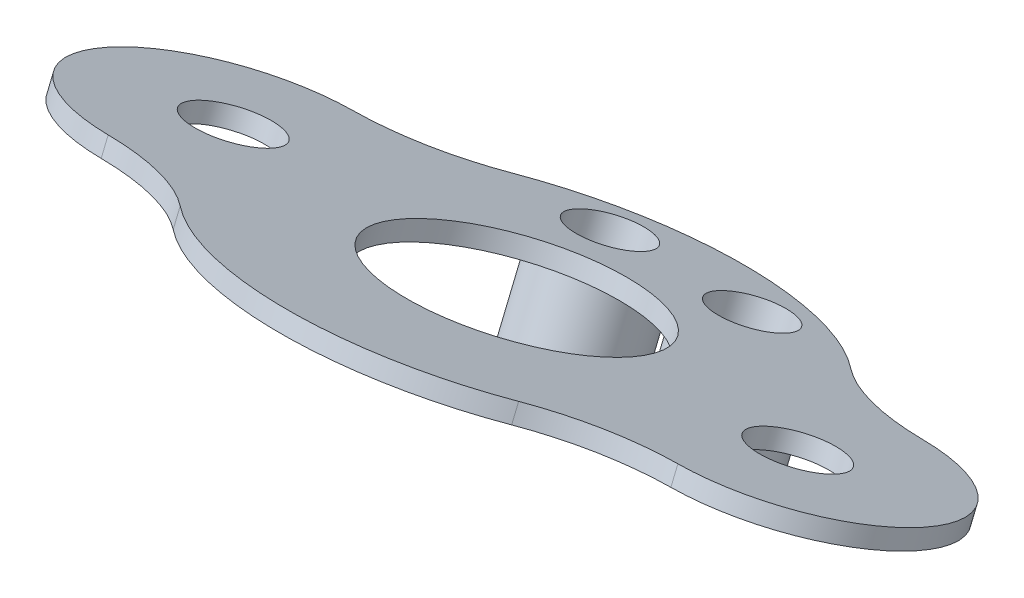
ISO-10303-21;
HEADER;
FILE_DESCRIPTION(('STEP AP214'),'2;1');
FILE_NAME('part.step','',(''),(''),'','','');
FILE_SCHEMA(('AUTOMOTIVE_DESIGN { 1 0 10303 214 1 1 1 1 }'));
ENDSEC;
DATA;
#1=APPLICATION_CONTEXT('core data for automotive mechanical design processes');
#2=APPLICATION_PROTOCOL_DEFINITION('international standard','automotive_design',2000,#1);
#3=PRODUCT_CONTEXT('',#1,'mechanical');
#4=PRODUCT('Part','Part','',(#3));
#5=PRODUCT_RELATED_PRODUCT_CATEGORY('part','',(#4));
#6=PRODUCT_DEFINITION_FORMATION('','',#4);
#7=PRODUCT_DEFINITION_CONTEXT('part definition',#1,'design');
#8=PRODUCT_DEFINITION('design','',#6,#7);
#9=PRODUCT_DEFINITION_SHAPE('','',#8);
#10=(LENGTH_UNIT() NAMED_UNIT(*) SI_UNIT(.MILLI.,.METRE.));
#11=(NAMED_UNIT(*) PLANE_ANGLE_UNIT() SI_UNIT($,.RADIAN.));
#12=(NAMED_UNIT(*) SI_UNIT($,.STERADIAN.) SOLID_ANGLE_UNIT());
#13=UNCERTAINTY_MEASURE_WITH_UNIT(LENGTH_MEASURE(1.E-05),#10,'distance_accuracy_value','');
#14=(GEOMETRIC_REPRESENTATION_CONTEXT(3) GLOBAL_UNCERTAINTY_ASSIGNED_CONTEXT((#13)) GLOBAL_UNIT_ASSIGNED_CONTEXT((#10,
#11,#12)) REPRESENTATION_CONTEXT('',''));
#15=CARTESIAN_POINT('',(0.,0.,0.));
#16=DIRECTION('',(0.,0.,1.));
#17=DIRECTION('',(1.,0.,0.));
#18=AXIS2_PLACEMENT_3D('',#15,#16,#17);
#19=CARTESIAN_POINT('',(0.,-29.9756447491099,12.4163185959592));
#20=DIRECTION('',(0.,-0.923879532511286,0.382683432365091));
#21=DIRECTION('',(0.,-0.382683432365091,-0.923879532511286));
#22=AXIS2_PLACEMENT_3D('',#19,#20,#21);
#23=PLANE('',#22);
#24=CARTESIAN_POINT('',(15.3672432244122,-30.7811706415145,10.4716070616733));
#25=DIRECTION('',(0.,-0.923879532511286,0.382683432365091));
#26=DIRECTION('',(0.,-0.382683432365091,-0.923879532511286));
#27=AXIS2_PLACEMENT_3D('',#24,#25,#26);
#28=CIRCLE('',#27,2.24999999999842);
#29=CARTESIAN_POINT('',(15.3672432244122,-31.6422083643353,8.39287811352438));
#30=VERTEX_POINT('',#29);
#31=EDGE_CURVE('E247',#30,#30,#28,.T.);
#32=ORIENTED_EDGE('',*,*,#31,.T.);
#33=EDGE_LOOP('',(#32));
#34=FACE_BOUND('',#33,.T.);
#35=CARTESIAN_POINT('',(-3.92196684187772,-34.5186678296089,1.44849066084454));
#36=DIRECTION('',(0.,-0.923879532511286,0.382683432365091));
#37=DIRECTION('',(0.,-0.382683432365091,-0.923879532511286));
#38=AXIS2_PLACEMENT_3D('',#35,#36,#37);
#39=CIRCLE('',#38,2.);
#40=CARTESIAN_POINT('',(-3.92196684187772,-35.284034694339,-0.399268404178036));
#41=VERTEX_POINT('',#40);
#42=EDGE_CURVE('E53',#41,#41,#39,.T.);
#43=ORIENTED_EDGE('',*,*,#42,.T.);
#44=EDGE_LOOP('',(#43));
#45=FACE_BOUND('',#44,.T.);
#46=CARTESIAN_POINT('',(3.82318641332406,-34.5309823384265,1.41876080664299));
#47=DIRECTION('',(0.,-0.923879532511286,0.382683432365091));
#48=DIRECTION('',(0.,-0.382683432365091,-0.923879532511286));
#49=AXIS2_PLACEMENT_3D('',#46,#47,#48);
#50=CIRCLE('',#49,2.);
#51=CARTESIAN_POINT('',(3.82318641332406,-35.2963492031567,-0.428998258379579));
#52=VERTEX_POINT('',#51);
#53=EDGE_CURVE('E250',#52,#52,#50,.T.);
#54=ORIENTED_EDGE('',*,*,#53,.T.);
#55=EDGE_LOOP('',(#54));
#56=FACE_BOUND('',#55,.T.);
#57=CARTESIAN_POINT('',(-15.5,-30.7811715076341,10.4716049706756));
#58=DIRECTION('',(0.,-0.923879532511286,0.382683432365091));
#59=DIRECTION('',(0.,-0.382683432365091,-0.923879532511286));
#60=AXIS2_PLACEMENT_3D('',#57,#58,#59);
#61=CIRCLE('',#60,2.25);
#62=CARTESIAN_POINT('',(-15.5,-31.6422092304555,8.39287602252525));
#63=VERTEX_POINT('',#62);
#64=EDGE_CURVE('E243',#63,#63,#61,.T.);
#65=ORIENTED_EDGE('',*,*,#64,.T.);
#66=EDGE_LOOP('',(#65));
#67=FACE_BOUND('',#66,.T.);
#68=CARTESIAN_POINT('',(0.,-30.7811715076341,10.4716049706756));
#69=DIRECTION('',(0.,-0.923879532511286,0.382683432365091));
#70=DIRECTION('',(0.,-0.382683432365091,-0.923879532511286));
#71=AXIS2_PLACEMENT_3D('',#68,#69,#70);
#72=CIRCLE('',#71,6.5);
#73=CARTESIAN_POINT('',(0.,-33.2686138180071,4.46638800935228));
#74=VERTEX_POINT('',#73);
#75=EDGE_CURVE('E139',#74,#74,#72,.T.);
#76=ORIENTED_EDGE('',*,*,#75,.T.);
#77=EDGE_LOOP('',(#76));
#78=FACE_BOUND('',#77,.T.);
#79=CARTESIAN_POINT('',(-15.496913231097,-30.7811706415145,10.4716070616731));
#80=DIRECTION('',(0.,-0.923879532511286,0.382683432365091));
#81=DIRECTION('',(0.,-0.382683432365091,-0.923879532511286));
#82=AXIS2_PLACEMENT_3D('',#79,#80,#81);
#83=CIRCLE('',#82,7.25000000000001);
#84=CARTESIAN_POINT('',(-15.6411975797355,-28.0072652384155,17.1684071065748));
#85=VERTEX_POINT('',#84);
#86=CARTESIAN_POINT('',(-15.6411975797355,-33.5550760446136,3.77480701677136));
#87=VERTEX_POINT('',#86);
#88=EDGE_CURVE('E131',#85,#87,#83,.T.);
#89=ORIENTED_EDGE('',*,*,#88,.F.);
#90=CARTESIAN_POINT('',(-15.8302598296755,-24.3724926412512,25.9435244067909));
#91=DIRECTION('',(0.,-0.923879532511286,0.382683432365091));
#92=DIRECTION('',(0.,-0.382683432365091,-0.923879532511286));
#93=AXIS2_PLACEMENT_3D('',#90,#91,#92);
#94=CIRCLE('',#93,9.5);
#95=CARTESIAN_POINT('',(-9.3184539231463,-27.0195552935339,19.5529498511988));
#96=VERTEX_POINT('',#95);
#97=EDGE_CURVE('E148',#96,#85,#94,.F.);
#98=ORIENTED_EDGE('',*,*,#97,.F.);
#99=CARTESIAN_POINT('',(-0.0648350033416456,-30.7811706415145,10.4716070616731));
#100=DIRECTION('',(0.,-0.923879532511286,0.382683432365091));
#101=DIRECTION('',(0.,-0.382683432365091,-0.923879532511286));
#102=AXIS2_PLACEMENT_3D('',#99,#100,#101);
#103=CIRCLE('',#102,13.5);
#104=CARTESIAN_POINT('',(9.18878391646293,-27.0195552935339,19.5529498511989));
#105=VERTEX_POINT('',#104);
#106=EDGE_CURVE('E226',#105,#96,#103,.T.);
#107=ORIENTED_EDGE('',*,*,#106,.F.);
#108=CARTESIAN_POINT('',(15.7005898229921,-24.3724926412511,25.9435244067911));
#109=DIRECTION('',(0.,-0.923879532511286,0.382683432365091));
#110=DIRECTION('',(0.,-0.382683432365091,-0.923879532511286));
#111=AXIS2_PLACEMENT_3D('',#108,#109,#110);
#112=CIRCLE('',#111,9.5);
#113=CARTESIAN_POINT('',(15.5115275730522,-28.0072652384154,17.168407106575));
#114=VERTEX_POINT('',#113);
#115=EDGE_CURVE('E229',#114,#105,#112,.F.);
#116=ORIENTED_EDGE('',*,*,#115,.F.);
#117=CARTESIAN_POINT('',(15.3672432244122,-30.7811706415145,10.4716070616733));
#118=DIRECTION('',(0.,-0.923879532511286,0.382683432365091));
#119=DIRECTION('',(0.,-0.382683432365091,-0.923879532511286));
#120=AXIS2_PLACEMENT_3D('',#117,#118,#119);
#121=CIRCLE('',#120,7.25000000000004);
#122=CARTESIAN_POINT('',(15.5115275730525,-33.5550760446135,3.77480701677158));
#123=VERTEX_POINT('',#122);
#124=EDGE_CURVE('E232',#123,#114,#121,.T.);
#125=ORIENTED_EDGE('',*,*,#124,.F.);
#126=CARTESIAN_POINT('',(15.7005898229925,-37.1898486417778,-5.0003102834445));
#127=DIRECTION('',(0.,-0.923879532511286,0.382683432365091));
#128=DIRECTION('',(0.,-0.382683432365091,-0.923879532511286));
#129=AXIS2_PLACEMENT_3D('',#126,#127,#128);
#130=CIRCLE('',#129,9.5);
#131=CARTESIAN_POINT('',(9.18878391646324,-34.5427859894952,1.39026427214755));
#132=VERTEX_POINT('',#131);
#133=EDGE_CURVE('E235',#132,#123,#130,.F.);
#134=ORIENTED_EDGE('',*,*,#133,.F.);
#135=CARTESIAN_POINT('',(-0.0648350033416456,-30.7811706415145,10.4716070616731));
#136=DIRECTION('',(0.,-0.923879532511286,0.382683432365091));
#137=DIRECTION('',(0.,-0.382683432365091,-0.923879532511286));
#138=AXIS2_PLACEMENT_3D('',#135,#136,#137);
#139=CIRCLE('',#138,13.5);
#140=CARTESIAN_POINT('',(-9.31845392314631,-34.5427859894952,1.39026427214741));
#141=VERTEX_POINT('',#140);
#142=EDGE_CURVE('E134',#141,#132,#139,.T.);
#143=ORIENTED_EDGE('',*,*,#142,.F.);
#144=CARTESIAN_POINT('',(-15.8302598296755,-37.1898486417779,-5.0003102834447));
#145=DIRECTION('',(0.,-0.923879532511286,0.382683432365091));
#146=DIRECTION('',(0.,-0.382683432365091,-0.923879532511286));
#147=AXIS2_PLACEMENT_3D('',#144,#145,#146);
#148=CIRCLE('',#147,9.5);
#149=EDGE_CURVE('E128',#87,#141,#148,.F.);
#150=ORIENTED_EDGE('',*,*,#149,.F.);
#151=EDGE_LOOP('',(#89,#98,#107,#116,#125,#134,#143,#150));
#152=FACE_BOUND('',#151,.T.);
#153=ADVANCED_FACE('F50',(#34,#45,#56,#67,#78,#152),#23,.F.);
#154=CARTESIAN_POINT('',(-3.92196684187772,-40.0619450246766,3.74459125503508));
#155=DIRECTION('',(0.,0.923879532511287,-0.382683432365091));
#156=DIRECTION('',(0.,0.382683432365091,0.923879532511287));
#157=AXIS2_PLACEMENT_3D('',#154,#155,#156);
#158=CYLINDRICAL_SURFACE('',#157,2.99938188325268);
#159=CARTESIAN_POINT('',(-3.92196684187772,-40.0619450246766,3.74459125503508));
#160=DIRECTION('',(0.,-0.923879532511286,0.382683432365091));
#161=DIRECTION('',(0.,-0.382683432365091,-0.923879532511286));
#162=AXIS2_PLACEMENT_3D('',#159,#160,#161);
#163=CIRCLE('',#162,2.99938188325268);
#164=CARTESIAN_POINT('',(-3.92196684187772,-41.2097587787334,0.973523722912777));
#165=VERTEX_POINT('',#164);
#166=EDGE_CURVE('E206',#165,#165,#163,.T.);
#167=ORIENTED_EDGE('',*,*,#166,.F.);
#168=EDGE_LOOP('',(#167));
#169=FACE_BOUND('',#168,.T.);
#170=CARTESIAN_POINT('',(-3.92196684187772,-35.4425473621201,1.83117409320963));
#171=DIRECTION('',(0.,-0.923879532511286,0.382683432365091));
#172=DIRECTION('',(0.,-0.382683432365091,-0.923879532511286));
#173=AXIS2_PLACEMENT_3D('',#170,#171,#172);
#174=CIRCLE('',#173,2.99938188325268);
#175=CARTESIAN_POINT('',(-5.02371258952765,-36.5101208354187,-0.746176264857528));
#176=VERTEX_POINT('',#175);
#177=EDGE_CURVE('E207',#176,#176,#174,.T.);
#178=ORIENTED_EDGE('',*,*,#177,.T.);
#179=EDGE_LOOP('',(#178));
#180=FACE_BOUND('',#179,.T.);
#181=ADVANCED_FACE('F277',(#169,#180),#158,.T.);
#182=CARTESIAN_POINT('',(3.82318641332406,-40.0742595334942,3.71486140083353));
#183=DIRECTION('',(0.,0.923879532511287,-0.382683432365091));
#184=DIRECTION('',(0.,0.382683432365091,0.923879532511287));
#185=AXIS2_PLACEMENT_3D('',#182,#183,#184);
#186=CYLINDRICAL_SURFACE('',#185,2.99938188325268);
#187=CARTESIAN_POINT('',(3.82318641332406,-40.0742595334942,3.71486140083353));
#188=DIRECTION('',(0.,-0.923879532511286,0.382683432365091));
#189=DIRECTION('',(0.,0.382683432365091,0.923879532511286));
#190=AXIS2_PLACEMENT_3D('',#187,#188,#189);
#191=CIRCLE('',#190,2.99938188325268);
#192=CARTESIAN_POINT('',(3.82318641332406,-38.9264457794374,6.48592893295584));
#193=VERTEX_POINT('',#192);
#194=EDGE_CURVE('E218',#193,#193,#191,.T.);
#195=ORIENTED_EDGE('',*,*,#194,.F.);
#196=EDGE_LOOP('',(#195));
#197=FACE_BOUND('',#196,.T.);
#198=CARTESIAN_POINT('',(3.82318641332406,-35.4548618709378,1.80144423900808));
#199=DIRECTION('',(0.,-0.923879532511286,0.382683432365091));
#200=DIRECTION('',(0.,0.382683432365091,0.923879532511286));
#201=AXIS2_PLACEMENT_3D('',#198,#199,#200);
#202=CIRCLE('',#201,2.99938188325268);
#203=CARTESIAN_POINT('',(4.38829935799805,-36.582118852568,-0.919994854323285));
#204=VERTEX_POINT('',#203);
#205=CARTESIAN_POINT('',(5.43144928763638,-36.4237224757199,-0.537592173105759));
#206=VERTEX_POINT('',#205);
#207=EDGE_CURVE('E59',#204,#206,#202,.T.);
#208=ORIENTED_EDGE('',*,*,#207,.T.);
#209=CARTESIAN_POINT('',(3.82318641332406,-35.4548618709378,1.80144423900808));
#210=DIRECTION('',(0.,-0.923879532511286,0.382683432365091));
#211=DIRECTION('',(0.,-0.382683432365091,-0.923879532511286));
#212=AXIS2_PLACEMENT_3D('',#209,#210,#211);
#213=CIRCLE('',#212,2.99938188325268);
#214=EDGE_CURVE('E66',#204,#206,#213,.F.);
#215=ORIENTED_EDGE('',*,*,#214,.F.);
#216=EDGE_LOOP('',(#208,#215));
#217=FACE_BOUND('',#216,.T.);
#218=ADVANCED_FACE('F282',(#197,#217),#186,.T.);
#219=CARTESIAN_POINT('',(3.82318641332406,-35.4548618709378,1.80144423900808));
#220=DIRECTION('',(0.,0.923879532511286,-0.382683432365091));
#221=DIRECTION('',(0.,0.382683432365091,0.923879532511286));
#222=AXIS2_PLACEMENT_3D('',#219,#220,#221);
#223=PLANE('',#222);
#224=CARTESIAN_POINT('',(-0.0648350033416456,-31.7050501740258,10.8542904940382));
#225=DIRECTION('',(0.,-0.923879532511286,0.382683432365091));
#226=DIRECTION('',(0.,-0.382683432365091,-0.923879532511286));
#227=AXIS2_PLACEMENT_3D('',#224,#225,#226);
#228=CIRCLE('',#227,13.5);
#229=EDGE_CURVE('E468',#204,#206,#228,.T.);
#230=ORIENTED_EDGE('',*,*,#229,.T.);
#231=ORIENTED_EDGE('',*,*,#207,.F.);
#232=EDGE_LOOP('',(#230,#231));
#233=FACE_BOUND('',#232,.T.);
#234=ADVANCED_FACE('F320',(#233),#223,.T.);
#235=CARTESIAN_POINT('',(-0.0648350033416456,-30.7811706415146,10.4716070616731));
#236=DIRECTION('',(0.,0.923879532511286,-0.382683432365091));
#237=DIRECTION('',(0.,0.382683432365091,0.923879532511286));
#238=AXIS2_PLACEMENT_3D('',#235,#236,#237);
#239=CYLINDRICAL_SURFACE('',#238,13.5);
#240=DIRECTION('',(0.,0.923879532511286,-0.382683432365091));
#241=VECTOR('',#240,1.);
#242=CARTESIAN_POINT('',(-9.31845392314631,-34.5427859894952,1.39026427214741));
#243=LINE('',#242,#241);
#244=CARTESIAN_POINT('',(-9.3184539231463,-35.4666655220065,1.77294770451251));
#245=VERTEX_POINT('',#244);
#246=EDGE_CURVE('E165',#245,#141,#243,.T.);
#247=ORIENTED_EDGE('',*,*,#246,.T.);
#248=ORIENTED_EDGE('',*,*,#142,.T.);
#249=DIRECTION('',(0.,0.923879532511286,-0.382683432365091));
#250=VECTOR('',#249,1.);
#251=CARTESIAN_POINT('',(9.18878391646324,-34.5427859894952,1.39026427214755));
#252=LINE('',#251,#250);
#253=CARTESIAN_POINT('',(9.18878391646323,-35.4666655220064,1.77294770451266));
#254=VERTEX_POINT('',#253);
#255=EDGE_CURVE('E163',#254,#132,#252,.T.);
#256=ORIENTED_EDGE('',*,*,#255,.F.);
#257=EDGE_CURVE('E193',#206,#254,#228,.T.);
#258=ORIENTED_EDGE('',*,*,#257,.F.);
#259=ORIENTED_EDGE('',*,*,#229,.F.);
#260=EDGE_CURVE('E192',#176,#204,#228,.T.);
#261=ORIENTED_EDGE('',*,*,#260,.F.);
#262=EDGE_CURVE('E74',#245,#176,#228,.T.);
#263=ORIENTED_EDGE('',*,*,#262,.F.);
#264=EDGE_LOOP('',(#247,#248,#256,#258,#259,#261,#263));
#265=FACE_BOUND('',#264,.T.);
#266=ADVANCED_FACE('F316',(#265),#239,.T.);
#267=CARTESIAN_POINT('',(15.7005898229925,-37.1898486417778,-5.0003102834445));
#268=DIRECTION('',(0.,0.923879532511286,-0.382683432365091));
#269=DIRECTION('',(0.,0.382683432365091,0.923879532511286));
#270=AXIS2_PLACEMENT_3D('',#267,#268,#269);
#271=CYLINDRICAL_SURFACE('',#270,9.5);
#272=ORIENTED_EDGE('',*,*,#255,.T.);
#273=ORIENTED_EDGE('',*,*,#133,.T.);
#274=DIRECTION('',(0.,0.923879532511286,-0.382683432365091));
#275=VECTOR('',#274,1.);
#276=CARTESIAN_POINT('',(15.5115275730525,-33.5550760446135,3.77480701677158));
#277=LINE('',#276,#275);
#278=CARTESIAN_POINT('',(15.5115275730524,-34.4789555771248,4.15749044913667));
#279=VERTEX_POINT('',#278);
#280=EDGE_CURVE('E480',#279,#123,#277,.T.);
#281=ORIENTED_EDGE('',*,*,#280,.F.);
#282=CARTESIAN_POINT('',(15.7005898229925,-38.1137281742891,-4.61762685107941));
#283=DIRECTION('',(0.,0.923879532511286,-0.382683432365091));
#284=DIRECTION('',(0.,-0.382683432365091,-0.923879532511286));
#285=AXIS2_PLACEMENT_3D('',#282,#283,#284);
#286=CIRCLE('',#285,9.50000000000002);
#287=EDGE_CURVE('E186',#254,#279,#286,.T.);
#288=ORIENTED_EDGE('',*,*,#287,.F.);
#289=EDGE_LOOP('',(#272,#273,#281,#288));
#290=FACE_BOUND('',#289,.T.);
#291=ADVANCED_FACE('F319',(#290),#271,.F.);
#292=CARTESIAN_POINT('',(15.3672432244122,-30.7811706415145,10.4716070616733));
#293=DIRECTION('',(0.,0.923879532511286,-0.382683432365091));
#294=DIRECTION('',(0.,0.382683432365091,0.923879532511286));
#295=AXIS2_PLACEMENT_3D('',#292,#293,#294);
#296=CYLINDRICAL_SURFACE('',#295,7.25000000000004);
#297=ORIENTED_EDGE('',*,*,#280,.T.);
#298=ORIENTED_EDGE('',*,*,#124,.T.);
#299=DIRECTION('',(0.,0.923879532511286,-0.382683432365091));
#300=VECTOR('',#299,1.);
#301=CARTESIAN_POINT('',(15.5115275730522,-28.0072652384154,17.168407106575));
#302=LINE('',#301,#300);
#303=CARTESIAN_POINT('',(15.5115275730523,-28.9311447709267,17.5510905389401));
#304=VERTEX_POINT('',#303);
#305=EDGE_CURVE('E485',#304,#114,#302,.T.);
#306=ORIENTED_EDGE('',*,*,#305,.F.);
#307=CARTESIAN_POINT('',(15.3672432244122,-31.7050501740257,10.8542904940384));
#308=DIRECTION('',(0.,-0.923879532511286,0.382683432365091));
#309=DIRECTION('',(0.,-0.382683432365091,-0.923879532511286));
#310=AXIS2_PLACEMENT_3D('',#307,#308,#309);
#311=CIRCLE('',#310,7.25000000000004);
#312=EDGE_CURVE('E182',#279,#304,#311,.T.);
#313=ORIENTED_EDGE('',*,*,#312,.F.);
#314=EDGE_LOOP('',(#297,#298,#306,#313));
#315=FACE_BOUND('',#314,.T.);
#316=ADVANCED_FACE('F324',(#315),#296,.T.);
#317=CARTESIAN_POINT('',(15.7005898229921,-24.3724926412511,25.9435244067911));
#318=DIRECTION('',(0.,0.923879532511286,-0.382683432365091));
#319=DIRECTION('',(0.,0.382683432365091,0.923879532511286));
#320=AXIS2_PLACEMENT_3D('',#317,#318,#319);
#321=CYLINDRICAL_SURFACE('',#320,9.5);
#322=ORIENTED_EDGE('',*,*,#305,.T.);
#323=ORIENTED_EDGE('',*,*,#115,.T.);
#324=DIRECTION('',(0.,0.923879532511286,-0.382683432365091));
#325=VECTOR('',#324,1.);
#326=CARTESIAN_POINT('',(9.18878391646293,-27.0195552935339,19.5529498511989));
#327=LINE('',#326,#325);
#328=CARTESIAN_POINT('',(9.18878391646294,-27.9434348260451,19.935633283564));
#329=VERTEX_POINT('',#328);
#330=EDGE_CURVE('E489',#329,#105,#327,.T.);
#331=ORIENTED_EDGE('',*,*,#330,.F.);
#332=CARTESIAN_POINT('',(15.7005898229921,-25.2963721737624,26.3262078391562));
#333=DIRECTION('',(0.,0.923879532511286,-0.382683432365091));
#334=DIRECTION('',(0.,-0.382683432365091,-0.923879532511286));
#335=AXIS2_PLACEMENT_3D('',#332,#333,#334);
#336=CIRCLE('',#335,9.50000000000001);
#337=EDGE_CURVE('E178',#304,#329,#336,.T.);
#338=ORIENTED_EDGE('',*,*,#337,.F.);
#339=EDGE_LOOP('',(#322,#323,#331,#338));
#340=FACE_BOUND('',#339,.T.);
#341=ADVANCED_FACE('F328',(#340),#321,.F.);
#342=CARTESIAN_POINT('',(-0.0648350033416456,-30.7811706415146,10.4716070616731));
#343=DIRECTION('',(0.,0.923879532511286,-0.382683432365091));
#344=DIRECTION('',(0.,0.382683432365091,0.923879532511286));
#345=AXIS2_PLACEMENT_3D('',#342,#343,#344);
#346=CYLINDRICAL_SURFACE('',#345,13.5);
#347=ORIENTED_EDGE('',*,*,#330,.T.);
#348=ORIENTED_EDGE('',*,*,#106,.T.);
#349=DIRECTION('',(0.,0.923879532511286,-0.382683432365091));
#350=VECTOR('',#349,1.);
#351=CARTESIAN_POINT('',(-9.3184539231463,-27.0195552935339,19.5529498511988));
#352=LINE('',#351,#350);
#353=CARTESIAN_POINT('',(-9.31845392314631,-27.9434348260452,19.9356332835639));
#354=VERTEX_POINT('',#353);
#355=EDGE_CURVE('E159',#354,#96,#352,.T.);
#356=ORIENTED_EDGE('',*,*,#355,.F.);
#357=CARTESIAN_POINT('',(-0.0648350033416456,-31.7050501740258,10.8542904940382));
#358=DIRECTION('',(0.,-0.923879532511286,0.382683432365091));
#359=DIRECTION('',(0.,-0.382683432365091,-0.923879532511286));
#360=AXIS2_PLACEMENT_3D('',#357,#358,#359);
#361=CIRCLE('',#360,13.5);
#362=EDGE_CURVE('E174',#329,#354,#361,.T.);
#363=ORIENTED_EDGE('',*,*,#362,.F.);
#364=EDGE_LOOP('',(#347,#348,#356,#363));
#365=FACE_BOUND('',#364,.T.);
#366=ADVANCED_FACE('F297',(#365),#346,.T.);
#367=CARTESIAN_POINT('',(7.81787740982544,-34.9093891741575,3.11833182147939));
#368=DIRECTION('',(0.,-0.923879532511286,0.382683432365091));
#369=DIRECTION('',(0.,-0.382683432365091,-0.923879532511286));
#370=AXIS2_PLACEMENT_3D('',#367,#368,#369);
#371=PLANE('',#370);
#372=CARTESIAN_POINT('',(-15.5,-31.7050510401453,10.8542884030407));
#373=DIRECTION('',(0.,-0.923879532511286,0.382683432365091));
#374=DIRECTION('',(0.,-0.382683432365091,-0.923879532511286));
#375=AXIS2_PLACEMENT_3D('',#372,#373,#374);
#376=CIRCLE('',#375,2.25);
#377=CARTESIAN_POINT('',(-15.5,-32.5660887629668,8.77555945489033));
#378=VERTEX_POINT('',#377);
#379=EDGE_CURVE('E198',#378,#378,#376,.T.);
#380=ORIENTED_EDGE('',*,*,#379,.F.);
#381=EDGE_LOOP('',(#380));
#382=FACE_BOUND('',#381,.T.);
#383=ORIENTED_EDGE('',*,*,#260,.T.);
#384=ORIENTED_EDGE('',*,*,#214,.T.);
#385=ORIENTED_EDGE('',*,*,#257,.T.);
#386=ORIENTED_EDGE('',*,*,#287,.T.);
#387=ORIENTED_EDGE('',*,*,#312,.T.);
#388=ORIENTED_EDGE('',*,*,#337,.T.);
#389=ORIENTED_EDGE('',*,*,#362,.T.);
#390=CARTESIAN_POINT('',(-15.8302598296755,-25.2963721737625,26.326207839156));
#391=DIRECTION('',(0.,0.923879532511286,-0.382683432365091));
#392=DIRECTION('',(0.,-0.382683432365091,-0.923879532511286));
#393=AXIS2_PLACEMENT_3D('',#390,#391,#392);
#394=CIRCLE('',#393,9.49999999999999);
#395=CARTESIAN_POINT('',(-15.6411975797355,-28.9311447709268,17.5510905389399));
#396=VERTEX_POINT('',#395);
#397=EDGE_CURVE('E170',#354,#396,#394,.T.);
#398=ORIENTED_EDGE('',*,*,#397,.T.);
#399=CARTESIAN_POINT('',(-15.496913231097,-31.7050501740258,10.8542904940382));
#400=DIRECTION('',(0.,-0.923879532511286,0.382683432365091));
#401=DIRECTION('',(0.,-0.382683432365091,-0.923879532511286));
#402=AXIS2_PLACEMENT_3D('',#399,#400,#401);
#403=CIRCLE('',#402,7.25000000000002);
#404=CARTESIAN_POINT('',(-15.6411975797355,-34.4789555771249,4.15749044913643));
#405=VERTEX_POINT('',#404);
#406=EDGE_CURVE('E157',#396,#405,#403,.T.);
#407=ORIENTED_EDGE('',*,*,#406,.T.);
#408=CARTESIAN_POINT('',(-15.8302598296755,-38.1137281742892,-4.61762685107961));
#409=DIRECTION('',(0.,0.923879532511286,-0.382683432365091));
#410=DIRECTION('',(0.,-0.382683432365091,-0.923879532511286));
#411=AXIS2_PLACEMENT_3D('',#408,#409,#410);
#412=CIRCLE('',#411,9.49999999999998);
#413=EDGE_CURVE('E152',#405,#245,#412,.T.);
#414=ORIENTED_EDGE('',*,*,#413,.T.);
#415=ORIENTED_EDGE('',*,*,#262,.T.);
#416=ORIENTED_EDGE('',*,*,#177,.F.);
#417=EDGE_LOOP('',(#383,#384,#385,#386,#387,#388,#389,#398,#407,#414,#415,#416));
#418=FACE_BOUND('',#417,.T.);
#419=CARTESIAN_POINT('',(15.3672432244122,-31.7050501740257,10.8542904940384));
#420=DIRECTION('',(0.,-0.923879532511286,0.382683432365091));
#421=DIRECTION('',(0.,-0.382683432365091,-0.923879532511286));
#422=AXIS2_PLACEMENT_3D('',#419,#420,#421);
#423=CIRCLE('',#422,2.24999999999842);
#424=CARTESIAN_POINT('',(15.3672432244122,-32.5660878968466,8.77556154588947));
#425=VERTEX_POINT('',#424);
#426=EDGE_CURVE('E194',#425,#425,#423,.T.);
#427=ORIENTED_EDGE('',*,*,#426,.F.);
#428=EDGE_LOOP('',(#427));
#429=FACE_BOUND('',#428,.T.);
#430=CARTESIAN_POINT('',(0.,-31.7050510401453,10.8542884030407));
#431=DIRECTION('',(0.,-0.923879532511286,0.382683432365091));
#432=DIRECTION('',(0.,-0.382683432365091,-0.923879532511286));
#433=AXIS2_PLACEMENT_3D('',#430,#431,#432);
#434=CIRCLE('',#433,6.5);
#435=CARTESIAN_POINT('',(0.,-34.1924933505184,4.84907144171737));
#436=VERTEX_POINT('',#435);
#437=EDGE_CURVE('E202',#436,#436,#434,.T.);
#438=ORIENTED_EDGE('',*,*,#437,.F.);
#439=EDGE_LOOP('',(#438));
#440=FACE_BOUND('',#439,.T.);
#441=ADVANCED_FACE('F291',(#382,#418,#429,#440),#371,.T.);
#442=CARTESIAN_POINT('',(15.3672432244122,-30.7811706415145,10.4716070616733));
#443=DIRECTION('',(0.,0.923879532511286,-0.382683432365091));
#444=DIRECTION('',(0.,0.382683432365091,0.923879532511286));
#445=AXIS2_PLACEMENT_3D('',#442,#443,#444);
#446=CYLINDRICAL_SURFACE('',#445,2.24999999999842);
#447=ORIENTED_EDGE('',*,*,#31,.F.);
#448=EDGE_LOOP('',(#447));
#449=FACE_BOUND('',#448,.T.);
#450=ORIENTED_EDGE('',*,*,#426,.T.);
#451=EDGE_LOOP('',(#450));
#452=FACE_BOUND('',#451,.T.);
#453=ADVANCED_FACE('F287',(#449,#452),#446,.F.);
#454=CARTESIAN_POINT('',(-15.5,-30.7811715076341,10.4716049706756));
#455=DIRECTION('',(0.,0.923879532511286,-0.382683432365091));
#456=DIRECTION('',(0.,0.382683432365091,0.923879532511286));
#457=AXIS2_PLACEMENT_3D('',#454,#455,#456);
#458=CYLINDRICAL_SURFACE('',#457,2.25);
#459=ORIENTED_EDGE('',*,*,#64,.F.);
#460=EDGE_LOOP('',(#459));
#461=FACE_BOUND('',#460,.T.);
#462=ORIENTED_EDGE('',*,*,#379,.T.);
#463=EDGE_LOOP('',(#462));
#464=FACE_BOUND('',#463,.T.);
#465=ADVANCED_FACE('F290',(#461,#464),#458,.F.);
#466=CARTESIAN_POINT('',(0.,-30.7811715076341,10.4716049706756));
#467=DIRECTION('',(0.,0.923879532511286,-0.382683432365091));
#468=DIRECTION('',(0.,0.382683432365091,0.923879532511286));
#469=AXIS2_PLACEMENT_3D('',#466,#467,#468);
#470=CYLINDRICAL_SURFACE('',#469,6.5);
#471=ORIENTED_EDGE('',*,*,#75,.F.);
#472=EDGE_LOOP('',(#471));
#473=FACE_BOUND('',#472,.T.);
#474=ORIENTED_EDGE('',*,*,#437,.T.);
#475=EDGE_LOOP('',(#474));
#476=FACE_BOUND('',#475,.T.);
#477=ADVANCED_FACE('F302',(#473,#476),#470,.F.);
#478=CARTESIAN_POINT('',(-15.8302598296755,-37.1898486417779,-5.0003102834447));
#479=DIRECTION('',(0.,0.923879532511286,-0.382683432365091));
#480=DIRECTION('',(0.,0.382683432365091,0.923879532511286));
#481=AXIS2_PLACEMENT_3D('',#478,#479,#480);
#482=CYLINDRICAL_SURFACE('',#481,9.5);
#483=DIRECTION('',(0.,0.923879532511286,-0.382683432365091));
#484=VECTOR('',#483,1.);
#485=CARTESIAN_POINT('',(-15.6411975797355,-33.5550760446136,3.77480701677136));
#486=LINE('',#485,#484);
#487=EDGE_CURVE('E144',#405,#87,#486,.T.);
#488=ORIENTED_EDGE('',*,*,#487,.T.);
#489=ORIENTED_EDGE('',*,*,#149,.T.);
#490=ORIENTED_EDGE('',*,*,#246,.F.);
#491=ORIENTED_EDGE('',*,*,#413,.F.);
#492=EDGE_LOOP('',(#488,#489,#490,#491));
#493=FACE_BOUND('',#492,.T.);
#494=ADVANCED_FACE('F151',(#493),#482,.F.);
#495=CARTESIAN_POINT('',(-15.8302598296755,-24.3724926412512,25.9435244067909));
#496=DIRECTION('',(0.,0.923879532511286,-0.382683432365091));
#497=DIRECTION('',(0.,0.382683432365091,0.923879532511286));
#498=AXIS2_PLACEMENT_3D('',#495,#496,#497);
#499=CYLINDRICAL_SURFACE('',#498,9.5);
#500=ORIENTED_EDGE('',*,*,#355,.T.);
#501=ORIENTED_EDGE('',*,*,#97,.T.);
#502=DIRECTION('',(0.,0.923879532511286,-0.382683432365091));
#503=VECTOR('',#502,1.);
#504=CARTESIAN_POINT('',(-15.6411975797355,-28.0072652384155,17.1684071065748));
#505=LINE('',#504,#503);
#506=EDGE_CURVE('E146',#396,#85,#505,.T.);
#507=ORIENTED_EDGE('',*,*,#506,.F.);
#508=ORIENTED_EDGE('',*,*,#397,.F.);
#509=EDGE_LOOP('',(#500,#501,#507,#508));
#510=FACE_BOUND('',#509,.T.);
#511=ADVANCED_FACE('F310',(#510),#499,.F.);
#512=CARTESIAN_POINT('',(-15.496913231097,-30.7811706415146,10.4716070616731));
#513=DIRECTION('',(0.,0.923879532511286,-0.382683432365091));
#514=DIRECTION('',(0.,0.382683432365091,0.923879532511286));
#515=AXIS2_PLACEMENT_3D('',#512,#513,#514);
#516=CYLINDRICAL_SURFACE('',#515,7.25000000000001);
#517=ORIENTED_EDGE('',*,*,#506,.T.);
#518=ORIENTED_EDGE('',*,*,#88,.T.);
#519=ORIENTED_EDGE('',*,*,#487,.F.);
#520=ORIENTED_EDGE('',*,*,#406,.F.);
#521=EDGE_LOOP('',(#517,#518,#519,#520));
#522=FACE_BOUND('',#521,.T.);
#523=ADVANCED_FACE('F142',(#522),#516,.T.);
#524=CARTESIAN_POINT('',(-3.92196684187772,-40.0619450246766,3.74459125503508));
#525=DIRECTION('',(0.,-0.923879532511286,0.382683432365091));
#526=DIRECTION('',(0.,-0.382683432365091,-0.923879532511286));
#527=AXIS2_PLACEMENT_3D('',#524,#525,#526);
#528=PLANE('',#527);
#529=ORIENTED_EDGE('',*,*,#166,.T.);
#530=EDGE_LOOP('',(#529));
#531=FACE_BOUND('',#530,.T.);
#532=CARTESIAN_POINT('',(-3.92196684187772,-40.0619450246766,3.74459125503508));
#533=DIRECTION('',(0.,-0.923879532511286,0.382683432365091));
#534=DIRECTION('',(0.,-0.382683432365091,-0.923879532511286));
#535=AXIS2_PLACEMENT_3D('',#532,#533,#534);
#536=CIRCLE('',#535,2.);
#537=CARTESIAN_POINT('',(-3.92196684187772,-40.8273118894068,1.89683219001251));
#538=VERTEX_POINT('',#537);
#539=EDGE_CURVE('E211',#538,#538,#536,.T.);
#540=ORIENTED_EDGE('',*,*,#539,.F.);
#541=EDGE_LOOP('',(#540));
#542=FACE_BOUND('',#541,.T.);
#543=ADVANCED_FACE('F263',(#531,#542),#528,.T.);
#544=CARTESIAN_POINT('',(-3.92196684187772,-40.0619450246766,3.74459125503508));
#545=DIRECTION('',(0.,0.923879532511287,-0.382683432365091));
#546=DIRECTION('',(0.,0.382683432365091,0.923879532511287));
#547=AXIS2_PLACEMENT_3D('',#544,#545,#546);
#548=CYLINDRICAL_SURFACE('',#547,2.);
#549=ORIENTED_EDGE('',*,*,#539,.T.);
#550=EDGE_LOOP('',(#549));
#551=FACE_BOUND('',#550,.T.);
#552=ORIENTED_EDGE('',*,*,#42,.F.);
#553=EDGE_LOOP('',(#552));
#554=FACE_BOUND('',#553,.T.);
#555=ADVANCED_FACE('F260',(#551,#554),#548,.F.);
#556=CARTESIAN_POINT('',(3.82318641332406,-40.0742595334942,3.71486140083353));
#557=DIRECTION('',(0.,0.923879532511286,-0.382683432365091));
#558=DIRECTION('',(0.,0.382683432365091,0.923879532511286));
#559=AXIS2_PLACEMENT_3D('',#556,#557,#558);
#560=PLANE('',#559);
#561=ORIENTED_EDGE('',*,*,#194,.T.);
#562=EDGE_LOOP('',(#561));
#563=FACE_BOUND('',#562,.T.);
#564=CARTESIAN_POINT('',(3.82318641332406,-40.0742595334942,3.71486140083353));
#565=DIRECTION('',(0.,-0.923879532511286,0.382683432365091));
#566=DIRECTION('',(0.,0.382683432365091,0.923879532511286));
#567=AXIS2_PLACEMENT_3D('',#564,#565,#566);
#568=CIRCLE('',#567,2.);
#569=CARTESIAN_POINT('',(3.82318641332406,-39.3088926687641,5.56262046585611));
#570=VERTEX_POINT('',#569);
#571=EDGE_CURVE('E12',#570,#570,#568,.T.);
#572=ORIENTED_EDGE('',*,*,#571,.F.);
#573=EDGE_LOOP('',(#572));
#574=FACE_BOUND('',#573,.T.);
#575=ADVANCED_FACE('F262',(#563,#574),#560,.F.);
#576=CARTESIAN_POINT('',(3.82318641332406,-40.0742595334942,3.71486140083353));
#577=DIRECTION('',(0.,0.923879532511287,-0.382683432365091));
#578=DIRECTION('',(0.,0.382683432365091,0.923879532511287));
#579=AXIS2_PLACEMENT_3D('',#576,#577,#578);
#580=CYLINDRICAL_SURFACE('',#579,2.);
#581=ORIENTED_EDGE('',*,*,#571,.T.);
#582=EDGE_LOOP('',(#581));
#583=FACE_BOUND('',#582,.T.);
#584=ORIENTED_EDGE('',*,*,#53,.F.);
#585=EDGE_LOOP('',(#584));
#586=FACE_BOUND('',#585,.T.);
#587=ADVANCED_FACE('F270',(#583,#586),#580,.F.);
#588=CLOSED_SHELL('',(#153,#181,#218,#234,#266,#291,#316,#341,#366,#441,#453,#465,#477,#494,
#511,#523,#543,#555,#575,#587));
#589=MANIFOLD_SOLID_BREP('B2',#588);
#590=ADVANCED_BREP_SHAPE_REPRESENTATION('',(#18,#589),#14);
#591=SHAPE_DEFINITION_REPRESENTATION(#9,#590);
ENDSEC;
END-ISO-10303-21;
